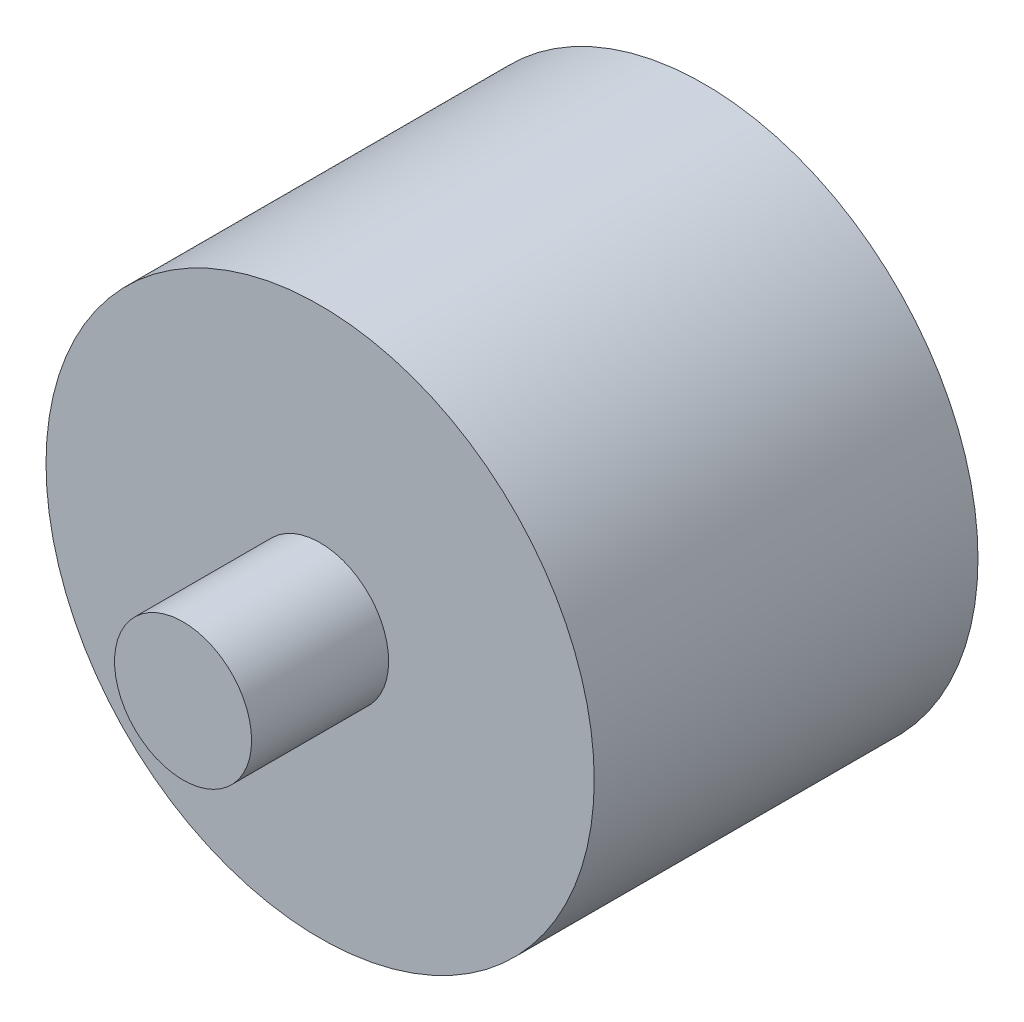
ISO-10303-21;
HEADER;
FILE_DESCRIPTION(('STEP AP214'),'2;1');
FILE_NAME('part.step','',(''),(''),'','','');
FILE_SCHEMA(('AUTOMOTIVE_DESIGN { 1 0 10303 214 1 1 1 1 }'));
ENDSEC;
DATA;
#1=APPLICATION_CONTEXT('core data for automotive mechanical design processes');
#2=APPLICATION_PROTOCOL_DEFINITION('international standard','automotive_design',2000,#1);
#3=PRODUCT_CONTEXT('',#1,'mechanical');
#4=PRODUCT('Part','Part','',(#3));
#5=PRODUCT_RELATED_PRODUCT_CATEGORY('part','',(#4));
#6=PRODUCT_DEFINITION_FORMATION('','',#4);
#7=PRODUCT_DEFINITION_CONTEXT('part definition',#1,'design');
#8=PRODUCT_DEFINITION('design','',#6,#7);
#9=PRODUCT_DEFINITION_SHAPE('','',#8);
#10=(LENGTH_UNIT() NAMED_UNIT(*) SI_UNIT(.MILLI.,.METRE.));
#11=(NAMED_UNIT(*) PLANE_ANGLE_UNIT() SI_UNIT($,.RADIAN.));
#12=(NAMED_UNIT(*) SI_UNIT($,.STERADIAN.) SOLID_ANGLE_UNIT());
#13=UNCERTAINTY_MEASURE_WITH_UNIT(LENGTH_MEASURE(1.E-05),#10,'distance_accuracy_value','');
#14=(GEOMETRIC_REPRESENTATION_CONTEXT(3) GLOBAL_UNCERTAINTY_ASSIGNED_CONTEXT((#13)) GLOBAL_UNIT_ASSIGNED_CONTEXT((#10,
#11,#12)) REPRESENTATION_CONTEXT('',''));
#15=CARTESIAN_POINT('',(0.,0.,0.));
#16=DIRECTION('',(0.,0.,1.));
#17=DIRECTION('',(1.,0.,0.));
#18=AXIS2_PLACEMENT_3D('',#15,#16,#17);
#19=CARTESIAN_POINT('',(0.,0.,24.));
#20=DIRECTION('',(0.,0.,-1.));
#21=DIRECTION('',(-1.,0.,0.));
#22=AXIS2_PLACEMENT_3D('',#19,#20,#21);
#23=CYLINDRICAL_SURFACE('',#22,2.5);
#24=CARTESIAN_POINT('',(0.,0.,19.));
#25=DIRECTION('',(0.,0.,1.));
#26=DIRECTION('',(1.,0.,0.));
#27=AXIS2_PLACEMENT_3D('',#24,#25,#26);
#28=CIRCLE('',#27,2.5);
#29=CARTESIAN_POINT('',(2.5,0.,19.));
#30=VERTEX_POINT('',#29);
#31=EDGE_CURVE('E42',#30,#30,#28,.T.);
#32=ORIENTED_EDGE('',*,*,#31,.T.);
#33=EDGE_LOOP('',(#32));
#34=FACE_BOUND('',#33,.T.);
#35=CARTESIAN_POINT('',(0.,0.,24.));
#36=DIRECTION('',(0.,0.,1.));
#37=DIRECTION('',(1.,0.,0.));
#38=AXIS2_PLACEMENT_3D('',#35,#36,#37);
#39=CIRCLE('',#38,2.5);
#40=CARTESIAN_POINT('',(2.5,0.,24.));
#41=VERTEX_POINT('',#40);
#42=EDGE_CURVE('E46',#41,#41,#39,.T.);
#43=ORIENTED_EDGE('',*,*,#42,.F.);
#44=EDGE_LOOP('',(#43));
#45=FACE_BOUND('',#44,.T.);
#46=ADVANCED_FACE('F39',(#34,#45),#23,.T.);
#47=CARTESIAN_POINT('',(0.,0.,24.));
#48=DIRECTION('',(0.,0.,1.));
#49=DIRECTION('',(1.,0.,0.));
#50=AXIS2_PLACEMENT_3D('',#47,#48,#49);
#51=PLANE('',#50);
#52=ORIENTED_EDGE('',*,*,#42,.T.);
#53=EDGE_LOOP('',(#52));
#54=FACE_BOUND('',#53,.T.);
#55=ADVANCED_FACE('F66',(#54),#51,.T.);
#56=CARTESIAN_POINT('',(0.,0.,-28.2842712474619));
#57=DIRECTION('',(0.,0.,1.));
#58=DIRECTION('',(1.,0.,0.));
#59=AXIS2_PLACEMENT_3D('',#56,#57,#58);
#60=CYLINDRICAL_SURFACE('',#59,10.);
#61=CARTESIAN_POINT('',(0.,0.,5.));
#62=DIRECTION('',(0.,0.,1.));
#63=DIRECTION('',(1.,0.,0.));
#64=AXIS2_PLACEMENT_3D('',#61,#62,#63);
#65=CIRCLE('',#64,10.);
#66=CARTESIAN_POINT('',(10.,0.,5.));
#67=VERTEX_POINT('',#66);
#68=EDGE_CURVE('E55',#67,#67,#65,.F.);
#69=ORIENTED_EDGE('',*,*,#68,.F.);
#70=EDGE_LOOP('',(#69));
#71=FACE_BOUND('',#70,.T.);
#72=CARTESIAN_POINT('',(0.,0.,19.));
#73=DIRECTION('',(0.,0.,1.));
#74=DIRECTION('',(1.,0.,0.));
#75=AXIS2_PLACEMENT_3D('',#72,#73,#74);
#76=CIRCLE('',#75,10.);
#77=CARTESIAN_POINT('',(10.,0.,19.));
#78=VERTEX_POINT('',#77);
#79=EDGE_CURVE('E58',#78,#78,#76,.T.);
#80=ORIENTED_EDGE('',*,*,#79,.F.);
#81=EDGE_LOOP('',(#80));
#82=FACE_BOUND('',#81,.T.);
#83=ADVANCED_FACE('F64',(#71,#82),#60,.T.);
#84=CARTESIAN_POINT('',(0.,0.,19.));
#85=DIRECTION('',(0.,0.,1.));
#86=DIRECTION('',(1.,0.,0.));
#87=AXIS2_PLACEMENT_3D('',#84,#85,#86);
#88=PLANE('',#87);
#89=ORIENTED_EDGE('',*,*,#31,.F.);
#90=EDGE_LOOP('',(#89));
#91=FACE_BOUND('',#90,.T.);
#92=ORIENTED_EDGE('',*,*,#79,.T.);
#93=EDGE_LOOP('',(#92));
#94=FACE_BOUND('',#93,.T.);
#95=ADVANCED_FACE('F62',(#91,#94),#88,.T.);
#96=CARTESIAN_POINT('',(0.,0.,5.));
#97=DIRECTION('',(0.,0.,1.));
#98=DIRECTION('',(1.,0.,0.));
#99=AXIS2_PLACEMENT_3D('',#96,#97,#98);
#100=PLANE('',#99);
#101=CARTESIAN_POINT('',(0.,0.,5.));
#102=DIRECTION('',(0.,0.,1.));
#103=DIRECTION('',(1.,0.,0.));
#104=AXIS2_PLACEMENT_3D('',#101,#102,#103);
#105=CIRCLE('',#104,2.5);
#106=CARTESIAN_POINT('',(2.5,0.,5.));
#107=VERTEX_POINT('',#106);
#108=EDGE_CURVE('E11',#107,#107,#105,.T.);
#109=ORIENTED_EDGE('',*,*,#108,.T.);
#110=EDGE_LOOP('',(#109));
#111=FACE_BOUND('',#110,.T.);
#112=ORIENTED_EDGE('',*,*,#68,.T.);
#113=EDGE_LOOP('',(#112));
#114=FACE_BOUND('',#113,.T.);
#115=ADVANCED_FACE('F73',(#111,#114),#100,.F.);
#116=CARTESIAN_POINT('',(0.,0.,0.));
#117=DIRECTION('',(0.,0.,1.));
#118=DIRECTION('',(1.,0.,0.));
#119=AXIS2_PLACEMENT_3D('',#116,#117,#118);
#120=PLANE('',#119);
#121=CARTESIAN_POINT('',(0.,0.,0.));
#122=DIRECTION('',(0.,0.,1.));
#123=DIRECTION('',(1.,0.,0.));
#124=AXIS2_PLACEMENT_3D('',#121,#122,#123);
#125=CIRCLE('',#124,2.5);
#126=CARTESIAN_POINT('',(2.5,0.,0.));
#127=VERTEX_POINT('',#126);
#128=EDGE_CURVE('E50',#127,#127,#125,.T.);
#129=ORIENTED_EDGE('',*,*,#128,.F.);
#130=EDGE_LOOP('',(#129));
#131=FACE_BOUND('',#130,.T.);
#132=ADVANCED_FACE('F88',(#131),#120,.F.);
#133=ORIENTED_EDGE('',*,*,#128,.T.);
#134=EDGE_LOOP('',(#133));
#135=FACE_BOUND('',#134,.T.);
#136=ORIENTED_EDGE('',*,*,#108,.F.);
#137=EDGE_LOOP('',(#136));
#138=FACE_BOUND('',#137,.T.);
#139=ADVANCED_FACE('F81',(#135,#138),#23,.T.);
#140=CLOSED_SHELL('',(#46,#55,#83,#95,#115,#132,#139));
#141=MANIFOLD_SOLID_BREP('B2',#140);
#142=ADVANCED_BREP_SHAPE_REPRESENTATION('',(#18,#141),#14);
#143=SHAPE_DEFINITION_REPRESENTATION(#9,#142);
ENDSEC;
END-ISO-10303-21;
